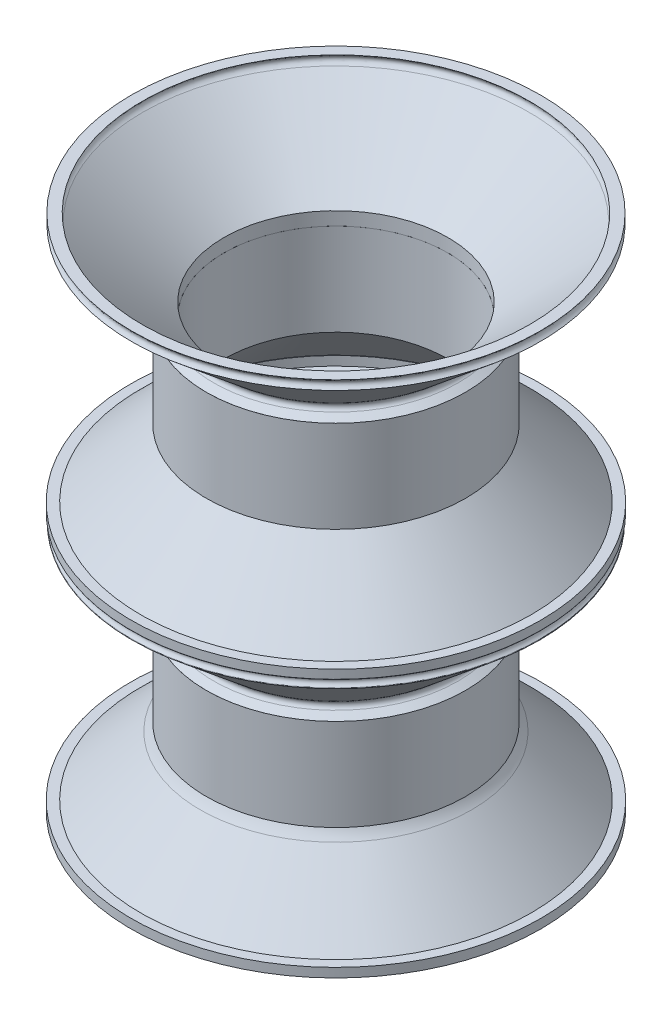
ISO-10303-21;
HEADER;
FILE_DESCRIPTION(('STEP AP214'),'2;1');
FILE_NAME('part.step','',(''),(''),'','','');
FILE_SCHEMA(('AUTOMOTIVE_DESIGN { 1 0 10303 214 1 1 1 1 }'));
ENDSEC;
DATA;
#1=APPLICATION_CONTEXT('core data for automotive mechanical design processes');
#2=APPLICATION_PROTOCOL_DEFINITION('international standard','automotive_design',2000,#1);
#3=PRODUCT_CONTEXT('',#1,'mechanical');
#4=PRODUCT('Part','Part','',(#3));
#5=PRODUCT_RELATED_PRODUCT_CATEGORY('part','',(#4));
#6=PRODUCT_DEFINITION_FORMATION('','',#4);
#7=PRODUCT_DEFINITION_CONTEXT('part definition',#1,'design');
#8=PRODUCT_DEFINITION('design','',#6,#7);
#9=PRODUCT_DEFINITION_SHAPE('','',#8);
#10=(LENGTH_UNIT() NAMED_UNIT(*) SI_UNIT(.MILLI.,.METRE.));
#11=(NAMED_UNIT(*) PLANE_ANGLE_UNIT() SI_UNIT($,.RADIAN.));
#12=(NAMED_UNIT(*) SI_UNIT($,.STERADIAN.) SOLID_ANGLE_UNIT());
#13=UNCERTAINTY_MEASURE_WITH_UNIT(LENGTH_MEASURE(1.E-05),#10,'distance_accuracy_value','');
#14=(GEOMETRIC_REPRESENTATION_CONTEXT(3) GLOBAL_UNCERTAINTY_ASSIGNED_CONTEXT((#13)) GLOBAL_UNIT_ASSIGNED_CONTEXT((#10,
#11,#12)) REPRESENTATION_CONTEXT('',''));
#15=CARTESIAN_POINT('',(0.,0.,0.));
#16=DIRECTION('',(0.,0.,1.));
#17=DIRECTION('',(1.,0.,0.));
#18=AXIS2_PLACEMENT_3D('',#15,#16,#17);
#19=CARTESIAN_POINT('',(12.266246150267,28.1,0.));
#20=DIRECTION('',(0.,-1.,0.));
#21=DIRECTION('',(1.,0.,0.));
#22=AXIS2_PLACEMENT_3D('',#19,#20,#21);
#23=CONICAL_SURFACE('',#22,12.7105503207346,1.02390555454664);
#24=CARTESIAN_POINT('',(12.266246150267,27.7377114557299,0.));
#25=DIRECTION('',(0.,-1.,0.));
#26=DIRECTION('',(1.,0.,0.));
#27=AXIS2_PLACEMENT_3D('',#24,#25,#26);
#28=CIRCLE('',#27,13.3056020683309);
#29=CARTESIAN_POINT('',(25.5718482185979,27.7377114557299,0.));
#30=VERTEX_POINT('',#29);
#31=EDGE_CURVE('E11',#30,#30,#28,.T.);
#32=ORIENTED_EDGE('',*,*,#31,.T.);
#33=EDGE_LOOP('',(#32));
#34=FACE_BOUND('',#33,.T.);
#35=CARTESIAN_POINT('',(12.266246150267,27.2518152658715,0.));
#36=DIRECTION('',(0.,1.,0.));
#37=DIRECTION('',(-1.,0.,0.));
#38=AXIS2_PLACEMENT_3D('',#35,#36,#37);
#39=CIRCLE('',#38,14.1036769219207);
#40=CARTESIAN_POINT('',(-1.83743077165368,27.2518152658715,0.));
#41=VERTEX_POINT('',#40);
#42=EDGE_CURVE('E75',#41,#41,#39,.T.);
#43=ORIENTED_EDGE('',*,*,#42,.T.);
#44=EDGE_LOOP('',(#43));
#45=FACE_BOUND('',#44,.T.);
#46=ADVANCED_FACE('F52',(#34,#45),#23,.T.);
#47=CARTESIAN_POINT('',(12.266246150267,36.1,0.));
#48=DIRECTION('',(0.,1.,0.));
#49=DIRECTION('',(-1.,0.,0.));
#50=AXIS2_PLACEMENT_3D('',#47,#48,#49);
#51=CONICAL_SURFACE('',#50,22.2445790614883,0.87266462599717);
#52=CARTESIAN_POINT('',(12.266246150267,28.5478064534284,0.));
#53=DIRECTION('',(0.,1.,0.));
#54=DIRECTION('',(-1.,0.,0.));
#55=AXIS2_PLACEMENT_3D('',#52,#53,#54);
#56=CIRCLE('',#55,13.2442252703947);
#57=CARTESIAN_POINT('',(-0.977979120127719,28.5478064534284,0.));
#58=VERTEX_POINT('',#57);
#59=EDGE_CURVE('E59',#58,#58,#56,.T.);
#60=ORIENTED_EDGE('',*,*,#59,.T.);
#61=EDGE_LOOP('',(#60));
#62=FACE_BOUND('',#61,.T.);
#63=CARTESIAN_POINT('',(12.266246150267,36.1,0.));
#64=DIRECTION('',(0.,1.,0.));
#65=DIRECTION('',(-1.,0.,0.));
#66=AXIS2_PLACEMENT_3D('',#63,#64,#65);
#67=CIRCLE('',#66,22.2445790614883);
#68=CARTESIAN_POINT('',(-9.97833291122136,36.1,0.));
#69=VERTEX_POINT('',#68);
#70=EDGE_CURVE('E63',#69,#69,#67,.T.);
#71=ORIENTED_EDGE('',*,*,#70,.F.);
#72=EDGE_LOOP('',(#71));
#73=FACE_BOUND('',#72,.T.);
#74=ADVANCED_FACE('F121',(#62,#73),#51,.T.);
#75=CARTESIAN_POINT('',(12.266246150267,28.6997502558786,0.));
#76=DIRECTION('',(0.,1.,0.));
#77=DIRECTION('',(-1.,0.,0.));
#78=AXIS2_PLACEMENT_3D('',#75,#76,#77);
#79=CONICAL_SURFACE('',#78,12.1807257813488,0.87266462599717);
#80=CARTESIAN_POINT('',(12.266246150267,36.1,0.));
#81=DIRECTION('',(0.,-1.,0.));
#82=DIRECTION('',(1.,0.,0.));
#83=AXIS2_PLACEMENT_3D('',#80,#81,#82);
#84=CIRCLE('',#83,21.);
#85=CARTESIAN_POINT('',(33.266246150267,36.1,0.));
#86=VERTEX_POINT('',#85);
#87=EDGE_CURVE('E84',#86,#86,#84,.T.);
#88=ORIENTED_EDGE('',*,*,#87,.F.);
#89=EDGE_LOOP('',(#88));
#90=FACE_BOUND('',#89,.T.);
#91=CARTESIAN_POINT('',(12.266246150267,28.6997502558786,0.));
#92=DIRECTION('',(0.,1.,0.));
#93=DIRECTION('',(-1.,0.,0.));
#94=AXIS2_PLACEMENT_3D('',#91,#92,#93);
#95=CIRCLE('',#94,12.1807257813488);
#96=CARTESIAN_POINT('',(0.0855203689181672,28.6997502558786,0.));
#97=VERTEX_POINT('',#96);
#98=EDGE_CURVE('E67',#97,#97,#95,.T.);
#99=ORIENTED_EDGE('',*,*,#98,.F.);
#100=EDGE_LOOP('',(#99));
#101=FACE_BOUND('',#100,.T.);
#102=ADVANCED_FACE('F117',(#90,#101),#79,.F.);
#103=CARTESIAN_POINT('',(12.266246150267,35.7090180328199,0.));
#104=DIRECTION('',(0.,1.,0.));
#105=DIRECTION('',(-1.,0.,0.));
#106=AXIS2_PLACEMENT_3D('',#103,#104,#105);
#107=CYLINDRICAL_SURFACE('',#106,12.1807257813488);
#108=ORIENTED_EDGE('',*,*,#98,.T.);
#109=EDGE_LOOP('',(#108));
#110=FACE_BOUND('',#109,.T.);
#111=CARTESIAN_POINT('',(12.266246150267,27.2518152658715,0.));
#112=DIRECTION('',(0.,1.,0.));
#113=DIRECTION('',(-1.,0.,0.));
#114=AXIS2_PLACEMENT_3D('',#111,#112,#113);
#115=CIRCLE('',#114,12.1807257813488);
#116=CARTESIAN_POINT('',(0.0855203689181672,27.2518152658715,0.));
#117=VERTEX_POINT('',#116);
#118=EDGE_CURVE('E72',#117,#117,#115,.T.);
#119=ORIENTED_EDGE('',*,*,#118,.F.);
#120=EDGE_LOOP('',(#119));
#121=FACE_BOUND('',#120,.T.);
#122=ADVANCED_FACE('F113',(#110,#121),#107,.F.);
#123=CARTESIAN_POINT('',(0.0855203689181681,27.2518152658715,0.));
#124=DIRECTION('',(0.,-1.,0.));
#125=DIRECTION('',(1.,0.,0.));
#126=AXIS2_PLACEMENT_3D('',#123,#124,#125);
#127=PLANE('',#126);
#128=ORIENTED_EDGE('',*,*,#118,.T.);
#129=EDGE_LOOP('',(#128));
#130=FACE_BOUND('',#129,.T.);
#131=ORIENTED_EDGE('',*,*,#42,.F.);
#132=EDGE_LOOP('',(#131));
#133=FACE_BOUND('',#132,.T.);
#134=ADVANCED_FACE('F110',(#130,#133),#127,.T.);
#135=CARTESIAN_POINT('',(12.266246150267,28.1647842318689,0.));
#136=DIRECTION('',(0.,1.,0.));
#137=DIRECTION('',(-1.,0.,0.));
#138=AXIS2_PLACEMENT_3D('',#135,#136,#137);
#139=TOROIDAL_SURFACE('',#138,13.565619075238,0.5);
#140=ORIENTED_EDGE('',*,*,#31,.F.);
#141=EDGE_LOOP('',(#140));
#142=FACE_BOUND('',#141,.T.);
#143=ORIENTED_EDGE('',*,*,#59,.F.);
#144=EDGE_LOOP('',(#143));
#145=FACE_BOUND('',#144,.T.);
#146=ADVANCED_FACE('F54',(#142,#145),#139,.F.);
#147=CARTESIAN_POINT('',(-8.73375384973302,36.1,0.));
#148=CARTESIAN_POINT('',(-9.41713424360817,36.5547580248928,0.));
#149=CARTESIAN_POINT('',(-8.79657882871846,37.1,0.));
#150=B_SPLINE_CURVE_WITH_KNOTS('',2,(#147,#148,#149),.UNSPECIFIED.,.F.,.F.,(3,3),(0.,1.),.UNSPECIFIED.);
#151=CARTESIAN_POINT('',(12.266246150267,8.13015566974782,0.));
#152=DIRECTION('',(0.,-1.,0.));
#153=AXIS1_PLACEMENT('',#151,#152);
#154=SURFACE_OF_REVOLUTION('',#150,#153);
#155=CARTESIAN_POINT('',(12.266246150267,37.1,0.));
#156=DIRECTION('',(0.,-1.,0.));
#157=DIRECTION('',(1.,0.,0.));
#158=AXIS2_PLACEMENT_3D('',#155,#156,#157);
#159=CIRCLE('',#158,21.0628249789854);
#160=CARTESIAN_POINT('',(33.3290711292524,37.1,0.));
#161=VERTEX_POINT('',#160);
#162=EDGE_CURVE('E78',#161,#161,#159,.T.);
#163=ORIENTED_EDGE('',*,*,#162,.F.);
#164=EDGE_LOOP('',(#163));
#165=FACE_BOUND('',#164,.T.);
#166=ORIENTED_EDGE('',*,*,#87,.T.);
#167=EDGE_LOOP('',(#166));
#168=FACE_BOUND('',#167,.T.);
#169=ADVANCED_FACE('F105',(#165,#168),#154,.T.);
#170=CARTESIAN_POINT('',(-8.79657882871846,37.1,0.));
#171=DIRECTION('',(0.,-1.,0.));
#172=DIRECTION('',(1.,0.,0.));
#173=AXIS2_PLACEMENT_3D('',#170,#171,#172);
#174=PLANE('',#173);
#175=CARTESIAN_POINT('',(12.266246150267,37.1,0.));
#176=DIRECTION('',(0.,-1.,0.));
#177=DIRECTION('',(1.,0.,0.));
#178=AXIS2_PLACEMENT_3D('',#175,#176,#177);
#179=CIRCLE('',#178,22.2445790614883);
#180=CARTESIAN_POINT('',(34.5108252117553,37.1,0.));
#181=VERTEX_POINT('',#180);
#182=EDGE_CURVE('E81',#181,#181,#179,.T.);
#183=ORIENTED_EDGE('',*,*,#182,.F.);
#184=EDGE_LOOP('',(#183));
#185=FACE_BOUND('',#184,.T.);
#186=ORIENTED_EDGE('',*,*,#162,.T.);
#187=EDGE_LOOP('',(#186));
#188=FACE_BOUND('',#187,.T.);
#189=ADVANCED_FACE('F101',(#185,#188),#174,.F.);
#190=CARTESIAN_POINT('',(-9.97833291122136,37.1,0.));
#191=CARTESIAN_POINT('',(-9.32229251414753,36.5833569168223,0.));
#192=CARTESIAN_POINT('',(-9.97833291122136,36.1,0.));
#193=B_SPLINE_CURVE_WITH_KNOTS('',2,(#190,#191,#192),.UNSPECIFIED.,.F.,.F.,(3,3),(0.,1.),.UNSPECIFIED.);
#194=CARTESIAN_POINT('',(12.266246150267,8.13015566974782,0.));
#195=DIRECTION('',(0.,-1.,0.));
#196=AXIS1_PLACEMENT('',#194,#195);
#197=SURFACE_OF_REVOLUTION('',#193,#196);
#198=ORIENTED_EDGE('',*,*,#70,.T.);
#199=EDGE_LOOP('',(#198));
#200=FACE_BOUND('',#199,.T.);
#201=ORIENTED_EDGE('',*,*,#182,.T.);
#202=EDGE_LOOP('',(#201));
#203=FACE_BOUND('',#202,.T.);
#204=ADVANCED_FACE('F98',(#200,#203),#197,.T.);
#205=CLOSED_SHELL('',(#46,#74,#102,#122,#134,#146,#169,#189,#204));
#206=MANIFOLD_SOLID_BREP('B2',#205);
#207=CARTESIAN_POINT('',(12.266246150267,17.2518152658715,0.));
#208=DIRECTION('',(0.,-1.,0.));
#209=DIRECTION('',(1.,0.,0.));
#210=AXIS2_PLACEMENT_3D('',#207,#208,#209);
#211=PLANE('',#210);
#212=CARTESIAN_POINT('',(12.266246150267,17.2518152658715,0.));
#213=DIRECTION('',(0.,-1.,0.));
#214=DIRECTION('',(1.,0.,0.));
#215=AXIS2_PLACEMENT_3D('',#212,#213,#214);
#216=CIRCLE('',#215,13.8777820561965);
#217=CARTESIAN_POINT('',(26.1440282064635,17.2518152658715,0.));
#218=VERTEX_POINT('',#217);
#219=EDGE_CURVE('E222',#218,#218,#216,.T.);
#220=ORIENTED_EDGE('',*,*,#219,.F.);
#221=EDGE_LOOP('',(#220));
#222=FACE_BOUND('',#221,.T.);
#223=CARTESIAN_POINT('',(12.266246150267,17.2518152658715,0.));
#224=DIRECTION('',(0.,-1.,0.));
#225=DIRECTION('',(1.,0.,0.));
#226=AXIS2_PLACEMENT_3D('',#223,#224,#225);
#227=CIRCLE('',#226,14.1036769219207);
#228=CARTESIAN_POINT('',(26.3699230721876,17.2518152658715,0.));
#229=VERTEX_POINT('',#228);
#230=EDGE_CURVE('E226',#229,#229,#227,.T.);
#231=ORIENTED_EDGE('',*,*,#230,.T.);
#232=EDGE_LOOP('',(#231));
#233=FACE_BOUND('',#232,.T.);
#234=ADVANCED_FACE('F211',(#222,#233),#211,.T.);
#235=CARTESIAN_POINT('',(12.266246150267,27.2518152658715,0.));
#236=DIRECTION('',(0.,-1.,0.));
#237=DIRECTION('',(1.,0.,0.));
#238=AXIS2_PLACEMENT_3D('',#235,#236,#237);
#239=PLANE('',#238);
#240=CARTESIAN_POINT('',(12.266246150267,27.2518152658715,0.));
#241=DIRECTION('',(0.,-1.,0.));
#242=DIRECTION('',(1.,0.,0.));
#243=AXIS2_PLACEMENT_3D('',#240,#241,#242);
#244=CIRCLE('',#243,14.1036769219207);
#245=CARTESIAN_POINT('',(26.3699230721876,27.2518152658715,0.));
#246=VERTEX_POINT('',#245);
#247=EDGE_CURVE('E229',#246,#246,#244,.T.);
#248=ORIENTED_EDGE('',*,*,#247,.F.);
#249=EDGE_LOOP('',(#248));
#250=FACE_BOUND('',#249,.T.);
#251=CARTESIAN_POINT('',(12.266246150267,27.2518152658715,0.));
#252=DIRECTION('',(0.,-1.,0.));
#253=DIRECTION('',(1.,0.,0.));
#254=AXIS2_PLACEMENT_3D('',#251,#252,#253);
#255=CIRCLE('',#254,12.1807257813488);
#256=CARTESIAN_POINT('',(24.4469719316158,27.2518152658715,0.));
#257=VERTEX_POINT('',#256);
#258=EDGE_CURVE('E232',#257,#257,#255,.T.);
#259=ORIENTED_EDGE('',*,*,#258,.T.);
#260=EDGE_LOOP('',(#259));
#261=FACE_BOUND('',#260,.T.);
#262=ADVANCED_FACE('F277',(#250,#261),#239,.F.);
#263=CARTESIAN_POINT('',(12.266246150267,17.2518152658715,0.));
#264=DIRECTION('',(0.,1.,0.));
#265=DIRECTION('',(-1.,0.,0.));
#266=AXIS2_PLACEMENT_3D('',#263,#264,#265);
#267=CYLINDRICAL_SURFACE('',#266,14.1036769219207);
#268=ORIENTED_EDGE('',*,*,#230,.F.);
#269=EDGE_LOOP('',(#268));
#270=FACE_BOUND('',#269,.T.);
#271=ORIENTED_EDGE('',*,*,#247,.T.);
#272=EDGE_LOOP('',(#271));
#273=FACE_BOUND('',#272,.T.);
#274=ADVANCED_FACE('F283',(#270,#273),#267,.T.);
#275=CARTESIAN_POINT('',(12.266246150267,17.2518152658715,0.));
#276=DIRECTION('',(0.,1.,0.));
#277=DIRECTION('',(-1.,0.,0.));
#278=AXIS2_PLACEMENT_3D('',#275,#276,#277);
#279=CYLINDRICAL_SURFACE('',#278,12.1807257813488);
#280=CARTESIAN_POINT('',(12.266246150267,17.2518152658715,0.));
#281=DIRECTION('',(0.,-1.,0.));
#282=DIRECTION('',(1.,0.,0.));
#283=AXIS2_PLACEMENT_3D('',#280,#281,#282);
#284=CIRCLE('',#283,12.1807257813488);
#285=CARTESIAN_POINT('',(24.4469719316158,17.2518152658715,0.));
#286=VERTEX_POINT('',#285);
#287=EDGE_CURVE('E240',#286,#286,#284,.T.);
#288=ORIENTED_EDGE('',*,*,#287,.T.);
#289=EDGE_LOOP('',(#288));
#290=FACE_BOUND('',#289,.T.);
#291=ORIENTED_EDGE('',*,*,#258,.F.);
#292=EDGE_LOOP('',(#291));
#293=FACE_BOUND('',#292,.T.);
#294=ADVANCED_FACE('F289',(#290,#293),#279,.F.);
#295=CARTESIAN_POINT('',(12.266246150267,17.2518152658715,0.));
#296=DIRECTION('',(0.,-1.,0.));
#297=DIRECTION('',(1.,0.,0.));
#298=AXIS2_PLACEMENT_3D('',#295,#296,#297);
#299=CONICAL_SURFACE('',#298,13.8777820561965,0.785398163397446);
#300=CARTESIAN_POINT('',(12.266246150267,9.87071250528384,0.));
#301=DIRECTION('',(0.,-1.,0.));
#302=DIRECTION('',(1.,0.,0.));
#303=AXIS2_PLACEMENT_3D('',#300,#301,#302);
#304=CIRCLE('',#303,21.2588848167841);
#305=CARTESIAN_POINT('',(33.5251309670511,9.87071250528385,0.));
#306=VERTEX_POINT('',#305);
#307=EDGE_CURVE('E236',#306,#306,#304,.T.);
#308=ORIENTED_EDGE('',*,*,#307,.F.);
#309=EDGE_LOOP('',(#308));
#310=FACE_BOUND('',#309,.T.);
#311=ORIENTED_EDGE('',*,*,#219,.T.);
#312=EDGE_LOOP('',(#311));
#313=FACE_BOUND('',#312,.T.);
#314=ADVANCED_FACE('F296',(#310,#313),#299,.T.);
#315=CARTESIAN_POINT('',(12.266246150267,9.87071250528384,0.));
#316=DIRECTION('',(0.,-1.,0.));
#317=DIRECTION('',(1.,0.,0.));
#318=AXIS2_PLACEMENT_3D('',#315,#316,#317);
#319=CONICAL_SURFACE('',#318,19.5618285419364,0.785398163397446);
#320=ORIENTED_EDGE('',*,*,#287,.F.);
#321=EDGE_LOOP('',(#320));
#322=FACE_BOUND('',#321,.T.);
#323=CARTESIAN_POINT('',(12.266246150267,9.87071250528384,0.));
#324=DIRECTION('',(0.,-1.,0.));
#325=DIRECTION('',(1.,0.,0.));
#326=AXIS2_PLACEMENT_3D('',#323,#324,#325);
#327=CIRCLE('',#326,19.5618285419364);
#328=CARTESIAN_POINT('',(31.8280746922034,9.87071250528384,0.));
#329=VERTEX_POINT('',#328);
#330=EDGE_CURVE('E241',#329,#329,#327,.T.);
#331=ORIENTED_EDGE('',*,*,#330,.T.);
#332=EDGE_LOOP('',(#331));
#333=FACE_BOUND('',#332,.T.);
#334=ADVANCED_FACE('F273',(#322,#333),#319,.F.);
#335=CARTESIAN_POINT('',(12.266246150267,9.87071250528384,0.));
#336=DIRECTION('',(0.,-1.,0.));
#337=DIRECTION('',(1.,0.,0.));
#338=AXIS2_PLACEMENT_3D('',#335,#336,#337);
#339=PLANE('',#338);
#340=CARTESIAN_POINT('',(12.266246150267,9.87071250528384,0.));
#341=DIRECTION('',(0.,-1.,0.));
#342=DIRECTION('',(1.,0.,0.));
#343=AXIS2_PLACEMENT_3D('',#340,#341,#342);
#344=CIRCLE('',#343,19.5118285419364);
#345=CARTESIAN_POINT('',(31.7780746922034,9.87071250528384,0.));
#346=VERTEX_POINT('',#345);
#347=EDGE_CURVE('E250',#346,#346,#344,.T.);
#348=ORIENTED_EDGE('',*,*,#347,.T.);
#349=EDGE_LOOP('',(#348));
#350=FACE_BOUND('',#349,.T.);
#351=ORIENTED_EDGE('',*,*,#330,.F.);
#352=EDGE_LOOP('',(#351));
#353=FACE_BOUND('',#352,.T.);
#354=ADVANCED_FACE('F262',(#350,#353),#339,.F.);
#355=CARTESIAN_POINT('',(12.266246150267,8.87071250528384,0.));
#356=DIRECTION('',(0.,-1.,0.));
#357=DIRECTION('',(1.,0.,0.));
#358=AXIS2_PLACEMENT_3D('',#355,#356,#357);
#359=PLANE('',#358);
#360=CARTESIAN_POINT('',(12.266246150267,8.87071250528384,0.));
#361=DIRECTION('',(0.,-1.,0.));
#362=DIRECTION('',(1.,0.,0.));
#363=AXIS2_PLACEMENT_3D('',#360,#361,#362);
#364=CIRCLE('',#363,22.2445790614883);
#365=CARTESIAN_POINT('',(34.5108252117553,8.87071250528384,0.));
#366=VERTEX_POINT('',#365);
#367=EDGE_CURVE('E218',#366,#366,#364,.T.);
#368=ORIENTED_EDGE('',*,*,#367,.T.);
#369=EDGE_LOOP('',(#368));
#370=FACE_BOUND('',#369,.T.);
#371=CARTESIAN_POINT('',(12.266246150267,8.87071250528384,0.));
#372=DIRECTION('',(0.,-1.,0.));
#373=DIRECTION('',(1.,0.,0.));
#374=AXIS2_PLACEMENT_3D('',#371,#372,#373);
#375=CIRCLE('',#374,19.5118285419364);
#376=CARTESIAN_POINT('',(31.7780746922034,8.87071250528384,0.));
#377=VERTEX_POINT('',#376);
#378=EDGE_CURVE('E249',#377,#377,#375,.T.);
#379=ORIENTED_EDGE('',*,*,#378,.F.);
#380=EDGE_LOOP('',(#379));
#381=FACE_BOUND('',#380,.T.);
#382=ADVANCED_FACE('F259',(#370,#381),#359,.T.);
#383=ORIENTED_EDGE('',*,*,#307,.T.);
#384=EDGE_LOOP('',(#383));
#385=FACE_BOUND('',#384,.T.);
#386=CARTESIAN_POINT('',(12.266246150267,9.87071250528384,0.));
#387=DIRECTION('',(0.,-1.,0.));
#388=DIRECTION('',(1.,0.,0.));
#389=AXIS2_PLACEMENT_3D('',#386,#387,#388);
#390=CIRCLE('',#389,22.2945790614883);
#391=CARTESIAN_POINT('',(34.5608252117553,9.87071250528384,0.));
#392=VERTEX_POINT('',#391);
#393=EDGE_CURVE('E244',#392,#392,#390,.T.);
#394=ORIENTED_EDGE('',*,*,#393,.F.);
#395=EDGE_LOOP('',(#394));
#396=FACE_BOUND('',#395,.T.);
#397=ADVANCED_FACE('F261',(#385,#396),#339,.F.);
#398=CARTESIAN_POINT('',(12.266246150267,8.87071250528384,0.));
#399=DIRECTION('',(0.,1.,0.));
#400=DIRECTION('',(-1.,0.,0.));
#401=AXIS2_PLACEMENT_3D('',#398,#399,#400);
#402=CYLINDRICAL_SURFACE('',#401,22.2945790614883);
#403=CARTESIAN_POINT('',(12.266246150267,8.92071250528384,0.));
#404=DIRECTION('',(0.,-1.,0.));
#405=DIRECTION('',(1.,0.,0.));
#406=AXIS2_PLACEMENT_3D('',#403,#404,#405);
#407=CIRCLE('',#406,22.2945790614883);
#408=CARTESIAN_POINT('',(34.5608252117553,8.92071250528384,0.));
#409=VERTEX_POINT('',#408);
#410=EDGE_CURVE('E51',#409,#409,#407,.F.);
#411=ORIENTED_EDGE('',*,*,#410,.T.);
#412=EDGE_LOOP('',(#411));
#413=FACE_BOUND('',#412,.T.);
#414=ORIENTED_EDGE('',*,*,#393,.T.);
#415=EDGE_LOOP('',(#414));
#416=FACE_BOUND('',#415,.T.);
#417=ADVANCED_FACE('F269',(#413,#416),#402,.T.);
#418=CARTESIAN_POINT('',(12.266246150267,8.87071250528384,0.));
#419=DIRECTION('',(0.,1.,0.));
#420=DIRECTION('',(-1.,0.,0.));
#421=AXIS2_PLACEMENT_3D('',#418,#419,#420);
#422=CYLINDRICAL_SURFACE('',#421,19.5118285419364);
#423=ORIENTED_EDGE('',*,*,#378,.T.);
#424=EDGE_LOOP('',(#423));
#425=FACE_BOUND('',#424,.T.);
#426=ORIENTED_EDGE('',*,*,#347,.F.);
#427=EDGE_LOOP('',(#426));
#428=FACE_BOUND('',#427,.T.);
#429=ADVANCED_FACE('F256',(#425,#428),#422,.F.);
#430=CARTESIAN_POINT('',(12.266246150267,8.92071250528384,0.));
#431=DIRECTION('',(0.,-1.,0.));
#432=DIRECTION('',(1.,0.,0.));
#433=AXIS2_PLACEMENT_3D('',#430,#431,#432);
#434=TOROIDAL_SURFACE('',#433,22.2445790614883,0.05);
#435=ORIENTED_EDGE('',*,*,#410,.F.);
#436=EDGE_LOOP('',(#435));
#437=FACE_BOUND('',#436,.T.);
#438=ORIENTED_EDGE('',*,*,#367,.F.);
#439=EDGE_LOOP('',(#438));
#440=FACE_BOUND('',#439,.T.);
#441=ADVANCED_FACE('F213',(#437,#440),#434,.T.);
#442=CLOSED_SHELL('',(#234,#262,#274,#294,#314,#334,#354,#382,#397,#417,#429,#441));
#443=MANIFOLD_SOLID_BREP('B6',#442);
#444=CARTESIAN_POINT('',(12.266246150267,-0.84818473412852,0.));
#445=DIRECTION('',(0.,-1.,0.));
#446=DIRECTION('',(1.,0.,0.));
#447=AXIS2_PLACEMENT_3D('',#444,#445,#446);
#448=PLANE('',#447);
#449=CARTESIAN_POINT('',(12.266246150267,-0.84818473412852,0.));
#450=DIRECTION('',(0.,-1.,0.));
#451=DIRECTION('',(1.,0.,0.));
#452=AXIS2_PLACEMENT_3D('',#449,#450,#451);
#453=CIRCLE('',#452,14.1036769219207);
#454=CARTESIAN_POINT('',(26.3699230721876,-0.848184734128518,0.));
#455=VERTEX_POINT('',#454);
#456=EDGE_CURVE('E412',#455,#455,#453,.T.);
#457=ORIENTED_EDGE('',*,*,#456,.F.);
#458=EDGE_LOOP('',(#457));
#459=FACE_BOUND('',#458,.T.);
#460=CARTESIAN_POINT('',(12.266246150267,-0.84818473412852,0.));
#461=DIRECTION('',(0.,-1.,0.));
#462=DIRECTION('',(1.,0.,0.));
#463=AXIS2_PLACEMENT_3D('',#460,#461,#462);
#464=CIRCLE('',#463,12.1807257813488);
#465=CARTESIAN_POINT('',(24.4469719316158,-0.848184734128518,0.));
#466=VERTEX_POINT('',#465);
#467=EDGE_CURVE('E418',#466,#466,#464,.T.);
#468=ORIENTED_EDGE('',*,*,#467,.T.);
#469=EDGE_LOOP('',(#468));
#470=FACE_BOUND('',#469,.T.);
#471=ADVANCED_FACE('F399',(#459,#470),#448,.F.);
#472=CARTESIAN_POINT('',(12.266246150267,-10.8481847341285,0.));
#473=DIRECTION('',(0.,1.,0.));
#474=DIRECTION('',(-1.,0.,0.));
#475=AXIS2_PLACEMENT_3D('',#472,#473,#474);
#476=CYLINDRICAL_SURFACE('',#475,14.1036769219207);
#477=CARTESIAN_POINT('',(12.266246150267,-10.8481847341285,0.));
#478=DIRECTION('',(0.,-1.,0.));
#479=DIRECTION('',(1.,0.,0.));
#480=AXIS2_PLACEMENT_3D('',#477,#478,#479);
#481=CIRCLE('',#480,14.1036769219207);
#482=CARTESIAN_POINT('',(26.3699230721876,-10.8481847341285,0.));
#483=VERTEX_POINT('',#482);
#484=EDGE_CURVE('E407',#483,#483,#481,.T.);
#485=ORIENTED_EDGE('',*,*,#484,.F.);
#486=EDGE_LOOP('',(#485));
#487=FACE_BOUND('',#486,.T.);
#488=ORIENTED_EDGE('',*,*,#456,.T.);
#489=EDGE_LOOP('',(#488));
#490=FACE_BOUND('',#489,.T.);
#491=ADVANCED_FACE('F472',(#487,#490),#476,.T.);
#492=CARTESIAN_POINT('',(12.266246150267,-10.8481847341285,0.));
#493=DIRECTION('',(0.,1.,0.));
#494=DIRECTION('',(-1.,0.,0.));
#495=AXIS2_PLACEMENT_3D('',#492,#493,#494);
#496=CYLINDRICAL_SURFACE('',#495,12.1807257813488);
#497=CARTESIAN_POINT('',(12.266246150267,-10.8481847341285,0.));
#498=DIRECTION('',(0.,-1.,0.));
#499=DIRECTION('',(1.,0.,0.));
#500=AXIS2_PLACEMENT_3D('',#497,#498,#499);
#501=CIRCLE('',#500,12.1807257813488);
#502=CARTESIAN_POINT('',(24.4469719316158,-10.8481847341285,0.));
#503=VERTEX_POINT('',#502);
#504=EDGE_CURVE('E427',#503,#503,#501,.T.);
#505=ORIENTED_EDGE('',*,*,#504,.T.);
#506=EDGE_LOOP('',(#505));
#507=FACE_BOUND('',#506,.T.);
#508=ORIENTED_EDGE('',*,*,#467,.F.);
#509=EDGE_LOOP('',(#508));
#510=FACE_BOUND('',#509,.T.);
#511=ADVANCED_FACE('F478',(#507,#510),#496,.F.);
#512=CARTESIAN_POINT('',(12.266246150267,-10.8481847341285,0.));
#513=DIRECTION('',(0.,-1.,0.));
#514=DIRECTION('',(1.,0.,0.));
#515=AXIS2_PLACEMENT_3D('',#512,#513,#514);
#516=CONICAL_SURFACE('',#515,13.8777820561965,0.785398163397446);
#517=CARTESIAN_POINT('',(12.266246150267,-11.7524412361696,0.));
#518=DIRECTION('',(0.,1.,0.));
#519=DIRECTION('',(-1.,0.,0.));
#520=AXIS2_PLACEMENT_3D('',#517,#518,#519);
#521=CIRCLE('',#520,14.7820385582376);
#522=CARTESIAN_POINT('',(-2.51579240797061,-11.7524412361696,0.));
#523=VERTEX_POINT('',#522);
#524=EDGE_CURVE('E210',#523,#523,#521,.F.);
#525=ORIENTED_EDGE('',*,*,#524,.T.);
#526=EDGE_LOOP('',(#525));
#527=FACE_BOUND('',#526,.T.);
#528=CARTESIAN_POINT('',(12.266246150267,-18.2292874947162,0.));
#529=DIRECTION('',(0.,-1.,0.));
#530=DIRECTION('',(1.,0.,0.));
#531=AXIS2_PLACEMENT_3D('',#528,#529,#530);
#532=CIRCLE('',#531,21.2588848167841);
#533=CARTESIAN_POINT('',(33.5251309670511,-18.2292874947162,0.));
#534=VERTEX_POINT('',#533);
#535=EDGE_CURVE('E423',#534,#534,#532,.T.);
#536=ORIENTED_EDGE('',*,*,#535,.F.);
#537=EDGE_LOOP('',(#536));
#538=FACE_BOUND('',#537,.T.);
#539=ADVANCED_FACE('F485',(#527,#538),#516,.T.);
#540=CARTESIAN_POINT('',(12.266246150267,-18.2292874947162,0.));
#541=DIRECTION('',(0.,-1.,0.));
#542=DIRECTION('',(1.,0.,0.));
#543=AXIS2_PLACEMENT_3D('',#540,#541,#542);
#544=CONICAL_SURFACE('',#543,19.5618285419364,0.785398163397446);
#545=ORIENTED_EDGE('',*,*,#504,.F.);
#546=EDGE_LOOP('',(#545));
#547=FACE_BOUND('',#546,.T.);
#548=CARTESIAN_POINT('',(12.266246150267,-18.2292874947162,0.));
#549=DIRECTION('',(0.,-1.,0.));
#550=DIRECTION('',(1.,0.,0.));
#551=AXIS2_PLACEMENT_3D('',#548,#549,#550);
#552=CIRCLE('',#551,19.5618285419364);
#553=CARTESIAN_POINT('',(31.8280746922034,-18.2292874947162,0.));
#554=VERTEX_POINT('',#553);
#555=EDGE_CURVE('E428',#554,#554,#552,.T.);
#556=ORIENTED_EDGE('',*,*,#555,.T.);
#557=EDGE_LOOP('',(#556));
#558=FACE_BOUND('',#557,.T.);
#559=ADVANCED_FACE('F468',(#547,#558),#544,.F.);
#560=CARTESIAN_POINT('',(12.266246150267,-18.2292874947162,0.));
#561=DIRECTION('',(0.,-1.,0.));
#562=DIRECTION('',(1.,0.,0.));
#563=AXIS2_PLACEMENT_3D('',#560,#561,#562);
#564=PLANE('',#563);
#565=CARTESIAN_POINT('',(12.266246150267,-18.2292874947162,0.));
#566=DIRECTION('',(0.,-1.,0.));
#567=DIRECTION('',(1.,0.,0.));
#568=AXIS2_PLACEMENT_3D('',#565,#566,#567);
#569=CIRCLE('',#568,19.5118285419364);
#570=CARTESIAN_POINT('',(31.7780746922034,-18.2292874947162,0.));
#571=VERTEX_POINT('',#570);
#572=EDGE_CURVE('E444',#571,#571,#569,.T.);
#573=ORIENTED_EDGE('',*,*,#572,.T.);
#574=EDGE_LOOP('',(#573));
#575=FACE_BOUND('',#574,.T.);
#576=ORIENTED_EDGE('',*,*,#555,.F.);
#577=EDGE_LOOP('',(#576));
#578=FACE_BOUND('',#577,.T.);
#579=ADVANCED_FACE('F458',(#575,#578),#564,.F.);
#580=CARTESIAN_POINT('',(12.266246150267,-19.2292874947162,0.));
#581=DIRECTION('',(0.,-1.,0.));
#582=DIRECTION('',(1.,0.,0.));
#583=AXIS2_PLACEMENT_3D('',#580,#581,#582);
#584=PLANE('',#583);
#585=CARTESIAN_POINT('',(12.266246150267,-19.2292874947162,0.));
#586=DIRECTION('',(0.,-1.,0.));
#587=DIRECTION('',(1.,0.,0.));
#588=AXIS2_PLACEMENT_3D('',#585,#586,#587);
#589=CIRCLE('',#588,22.2945790614883);
#590=CARTESIAN_POINT('',(34.5608252117553,-19.2292874947162,0.));
#591=VERTEX_POINT('',#590);
#592=EDGE_CURVE('E432',#591,#591,#589,.T.);
#593=ORIENTED_EDGE('',*,*,#592,.T.);
#594=EDGE_LOOP('',(#593));
#595=FACE_BOUND('',#594,.T.);
#596=CARTESIAN_POINT('',(12.266246150267,-19.2292874947162,0.));
#597=DIRECTION('',(0.,-1.,0.));
#598=DIRECTION('',(1.,0.,0.));
#599=AXIS2_PLACEMENT_3D('',#596,#597,#598);
#600=CIRCLE('',#599,19.5118285419364);
#601=CARTESIAN_POINT('',(31.7780746922034,-19.2292874947162,0.));
#602=VERTEX_POINT('',#601);
#603=EDGE_CURVE('E440',#602,#602,#600,.T.);
#604=ORIENTED_EDGE('',*,*,#603,.F.);
#605=EDGE_LOOP('',(#604));
#606=FACE_BOUND('',#605,.T.);
#607=ADVANCED_FACE('F455',(#595,#606),#584,.T.);
#608=ORIENTED_EDGE('',*,*,#535,.T.);
#609=EDGE_LOOP('',(#608));
#610=FACE_BOUND('',#609,.T.);
#611=CARTESIAN_POINT('',(12.266246150267,-18.2292874947162,0.));
#612=DIRECTION('',(0.,-1.,0.));
#613=DIRECTION('',(1.,0.,0.));
#614=AXIS2_PLACEMENT_3D('',#611,#612,#613);
#615=CIRCLE('',#614,22.2945790614883);
#616=CARTESIAN_POINT('',(34.5608252117553,-18.2292874947162,0.));
#617=VERTEX_POINT('',#616);
#618=EDGE_CURVE('E436',#617,#617,#615,.T.);
#619=ORIENTED_EDGE('',*,*,#618,.F.);
#620=EDGE_LOOP('',(#619));
#621=FACE_BOUND('',#620,.T.);
#622=ADVANCED_FACE('F457',(#610,#621),#564,.F.);
#623=CARTESIAN_POINT('',(12.266246150267,-19.2292874947162,0.));
#624=DIRECTION('',(0.,1.,0.));
#625=DIRECTION('',(-1.,0.,0.));
#626=AXIS2_PLACEMENT_3D('',#623,#624,#625);
#627=CYLINDRICAL_SURFACE('',#626,22.2945790614883);
#628=ORIENTED_EDGE('',*,*,#592,.F.);
#629=EDGE_LOOP('',(#628));
#630=FACE_BOUND('',#629,.T.);
#631=ORIENTED_EDGE('',*,*,#618,.T.);
#632=EDGE_LOOP('',(#631));
#633=FACE_BOUND('',#632,.T.);
#634=ADVANCED_FACE('F465',(#630,#633),#627,.T.);
#635=CARTESIAN_POINT('',(12.266246150267,-19.2292874947162,0.));
#636=DIRECTION('',(0.,1.,0.));
#637=DIRECTION('',(-1.,0.,0.));
#638=AXIS2_PLACEMENT_3D('',#635,#636,#637);
#639=CYLINDRICAL_SURFACE('',#638,19.5118285419364);
#640=ORIENTED_EDGE('',*,*,#603,.T.);
#641=EDGE_LOOP('',(#640));
#642=FACE_BOUND('',#641,.T.);
#643=ORIENTED_EDGE('',*,*,#572,.F.);
#644=EDGE_LOOP('',(#643));
#645=FACE_BOUND('',#644,.T.);
#646=ADVANCED_FACE('F452',(#642,#645),#639,.F.);
#647=CARTESIAN_POINT('',(12.266246150267,-8.92401411142341,0.));
#648=DIRECTION('',(0.,1.,0.));
#649=DIRECTION('',(-1.,0.,0.));
#650=AXIS2_PLACEMENT_3D('',#647,#648,#649);
#651=TOROIDAL_SURFACE('',#650,17.6104656829838,4.);
#652=ORIENTED_EDGE('',*,*,#484,.T.);
#653=EDGE_LOOP('',(#652));
#654=FACE_BOUND('',#653,.T.);
#655=ORIENTED_EDGE('',*,*,#524,.F.);
#656=EDGE_LOOP('',(#655));
#657=FACE_BOUND('',#656,.T.);
#658=ADVANCED_FACE('F401',(#654,#657),#651,.F.);
#659=CLOSED_SHELL('',(#471,#491,#511,#539,#559,#579,#607,#622,#634,#646,#658));
#660=MANIFOLD_SOLID_BREP('B46',#659);
#661=CARTESIAN_POINT('',(12.266246150267,0.,0.));
#662=DIRECTION('',(0.,-1.,0.));
#663=DIRECTION('',(1.,0.,0.));
#664=AXIS2_PLACEMENT_3D('',#661,#662,#663);
#665=CONICAL_SURFACE('',#664,12.7105503207346,1.02390555454664);
#666=CARTESIAN_POINT('',(12.266246150267,-0.362288544270145,0.));
#667=DIRECTION('',(0.,-1.,0.));
#668=DIRECTION('',(1.,0.,0.));
#669=AXIS2_PLACEMENT_3D('',#666,#667,#668);
#670=CIRCLE('',#669,13.3056020683309);
#671=CARTESIAN_POINT('',(25.5718482185979,-0.362288544270144,0.));
#672=VERTEX_POINT('',#671);
#673=EDGE_CURVE('E587',#672,#672,#670,.T.);
#674=ORIENTED_EDGE('',*,*,#673,.T.);
#675=EDGE_LOOP('',(#674));
#676=FACE_BOUND('',#675,.T.);
#677=CARTESIAN_POINT('',(12.266246150267,-0.848184734128519,0.));
#678=DIRECTION('',(0.,1.,0.));
#679=DIRECTION('',(-1.,0.,0.));
#680=AXIS2_PLACEMENT_3D('',#677,#678,#679);
#681=CIRCLE('',#680,14.1036769219207);
#682=CARTESIAN_POINT('',(-1.83743077165368,-0.848184734128521,0.));
#683=VERTEX_POINT('',#682);
#684=EDGE_CURVE('E602',#683,#683,#681,.T.);
#685=ORIENTED_EDGE('',*,*,#684,.T.);
#686=EDGE_LOOP('',(#685));
#687=FACE_BOUND('',#686,.T.);
#688=ADVANCED_FACE('F576',(#676,#687),#665,.T.);
#689=CARTESIAN_POINT('',(12.266246150267,8.,0.));
#690=DIRECTION('',(0.,1.,0.));
#691=DIRECTION('',(-1.,0.,0.));
#692=AXIS2_PLACEMENT_3D('',#689,#690,#691);
#693=CONICAL_SURFACE('',#692,22.2445790614883,0.87266462599717);
#694=CARTESIAN_POINT('',(12.266246150267,7.95996199984405,0.));
#695=DIRECTION('',(0.,1.,0.));
#696=DIRECTION('',(-1.,0.,0.));
#697=AXIS2_PLACEMENT_3D('',#694,#695,#696);
#698=CIRCLE('',#697,22.1968636309622);
#699=CARTESIAN_POINT('',(-9.93061748069522,7.95996199984405,0.));
#700=VERTEX_POINT('',#699);
#701=EDGE_CURVE('E398',#700,#700,#698,.F.);
#702=ORIENTED_EDGE('',*,*,#701,.T.);
#703=EDGE_LOOP('',(#702));
#704=FACE_BOUND('',#703,.T.);
#705=CARTESIAN_POINT('',(12.266246150267,0.44780645342838,0.));
#706=DIRECTION('',(0.,1.,0.));
#707=DIRECTION('',(-1.,0.,0.));
#708=AXIS2_PLACEMENT_3D('',#705,#706,#707);
#709=CIRCLE('',#708,13.2442252703947);
#710=CARTESIAN_POINT('',(-0.977979120127719,0.447806453428379,0.));
#711=VERTEX_POINT('',#710);
#712=EDGE_CURVE('E591',#711,#711,#709,.T.);
#713=ORIENTED_EDGE('',*,*,#712,.T.);
#714=EDGE_LOOP('',(#713));
#715=FACE_BOUND('',#714,.T.);
#716=ADVANCED_FACE('F648',(#704,#715),#693,.T.);
#717=CARTESIAN_POINT('',(12.266246150267,0.599750255878579,0.));
#718=DIRECTION('',(0.,1.,0.));
#719=DIRECTION('',(-1.,0.,0.));
#720=AXIS2_PLACEMENT_3D('',#717,#718,#719);
#721=CONICAL_SURFACE('',#720,12.1807257813488,0.87266462599717);
#722=CARTESIAN_POINT('',(12.266246150267,8.,0.));
#723=DIRECTION('',(0.,-1.,0.));
#724=DIRECTION('',(1.,0.,0.));
#725=AXIS2_PLACEMENT_3D('',#722,#723,#724);
#726=CIRCLE('',#725,21.);
#727=CARTESIAN_POINT('',(33.266246150267,8.00000000000001,0.));
#728=VERTEX_POINT('',#727);
#729=EDGE_CURVE('E611',#728,#728,#726,.T.);
#730=ORIENTED_EDGE('',*,*,#729,.F.);
#731=EDGE_LOOP('',(#730));
#732=FACE_BOUND('',#731,.T.);
#733=CARTESIAN_POINT('',(12.266246150267,0.599750255878579,0.));
#734=DIRECTION('',(0.,1.,0.));
#735=DIRECTION('',(-1.,0.,0.));
#736=AXIS2_PLACEMENT_3D('',#733,#734,#735);
#737=CIRCLE('',#736,12.1807257813488);
#738=CARTESIAN_POINT('',(0.0855203689181672,0.599750255878578,0.));
#739=VERTEX_POINT('',#738);
#740=EDGE_CURVE('E596',#739,#739,#737,.T.);
#741=ORIENTED_EDGE('',*,*,#740,.F.);
#742=EDGE_LOOP('',(#741));
#743=FACE_BOUND('',#742,.T.);
#744=ADVANCED_FACE('F644',(#732,#743),#721,.F.);
#745=CARTESIAN_POINT('',(12.266246150267,7.60901803281994,0.));
#746=DIRECTION('',(0.,1.,0.));
#747=DIRECTION('',(-1.,0.,0.));
#748=AXIS2_PLACEMENT_3D('',#745,#746,#747);
#749=CYLINDRICAL_SURFACE('',#748,12.1807257813488);
#750=ORIENTED_EDGE('',*,*,#740,.T.);
#751=EDGE_LOOP('',(#750));
#752=FACE_BOUND('',#751,.T.);
#753=CARTESIAN_POINT('',(12.266246150267,-0.848184734128519,0.));
#754=DIRECTION('',(0.,1.,0.));
#755=DIRECTION('',(-1.,0.,0.));
#756=AXIS2_PLACEMENT_3D('',#753,#754,#755);
#757=CIRCLE('',#756,12.1807257813488);
#758=CARTESIAN_POINT('',(0.0855203689181672,-0.848184734128521,0.));
#759=VERTEX_POINT('',#758);
#760=EDGE_CURVE('E599',#759,#759,#757,.T.);
#761=ORIENTED_EDGE('',*,*,#760,.F.);
#762=EDGE_LOOP('',(#761));
#763=FACE_BOUND('',#762,.T.);
#764=ADVANCED_FACE('F640',(#752,#763),#749,.F.);
#765=CARTESIAN_POINT('',(0.0855203689181681,-0.848184734128521,0.));
#766=DIRECTION('',(0.,-1.,0.));
#767=DIRECTION('',(1.,0.,0.));
#768=AXIS2_PLACEMENT_3D('',#765,#766,#767);
#769=PLANE('',#768);
#770=ORIENTED_EDGE('',*,*,#760,.T.);
#771=EDGE_LOOP('',(#770));
#772=FACE_BOUND('',#771,.T.);
#773=ORIENTED_EDGE('',*,*,#684,.F.);
#774=EDGE_LOOP('',(#773));
#775=FACE_BOUND('',#774,.T.);
#776=ADVANCED_FACE('F637',(#772,#775),#769,.T.);
#777=CARTESIAN_POINT('',(12.266246150267,0.0647842318688887,0.));
#778=DIRECTION('',(0.,1.,0.));
#779=DIRECTION('',(-1.,0.,0.));
#780=AXIS2_PLACEMENT_3D('',#777,#778,#779);
#781=TOROIDAL_SURFACE('',#780,13.565619075238,0.5);
#782=ORIENTED_EDGE('',*,*,#673,.F.);
#783=EDGE_LOOP('',(#782));
#784=FACE_BOUND('',#783,.T.);
#785=ORIENTED_EDGE('',*,*,#712,.F.);
#786=EDGE_LOOP('',(#785));
#787=FACE_BOUND('',#786,.T.);
#788=ADVANCED_FACE('F635',(#784,#787),#781,.F.);
#789=CARTESIAN_POINT('',(-8.73375384973302,8.,0.));
#790=CARTESIAN_POINT('',(-9.41713424360817,8.45475802489276,0.));
#791=CARTESIAN_POINT('',(-8.79657882871846,9.,0.));
#792=B_SPLINE_CURVE_WITH_KNOTS('',2,(#789,#790,#791),.UNSPECIFIED.,.F.,.F.,(3,3),(0.,1.),.UNSPECIFIED.);
#793=CARTESIAN_POINT('',(12.266246150267,-19.9698443302522,0.));
#794=DIRECTION('',(0.,-1.,0.));
#795=AXIS1_PLACEMENT('',#793,#794);
#796=SURFACE_OF_REVOLUTION('',#792,#795);
#797=CARTESIAN_POINT('',(12.266246150267,9.00000000000001,0.));
#798=DIRECTION('',(0.,-1.,0.));
#799=DIRECTION('',(1.,0.,0.));
#800=AXIS2_PLACEMENT_3D('',#797,#798,#799);
#801=CIRCLE('',#800,21.0628249789854);
#802=CARTESIAN_POINT('',(33.3290711292524,9.00000000000001,0.));
#803=VERTEX_POINT('',#802);
#804=EDGE_CURVE('E605',#803,#803,#801,.T.);
#805=ORIENTED_EDGE('',*,*,#804,.F.);
#806=EDGE_LOOP('',(#805));
#807=FACE_BOUND('',#806,.T.);
#808=ORIENTED_EDGE('',*,*,#729,.T.);
#809=EDGE_LOOP('',(#808));
#810=FACE_BOUND('',#809,.T.);
#811=ADVANCED_FACE('F631',(#807,#810),#796,.T.);
#812=CARTESIAN_POINT('',(-8.79657882871846,9.,0.));
#813=DIRECTION('',(0.,-1.,0.));
#814=DIRECTION('',(1.,0.,0.));
#815=AXIS2_PLACEMENT_3D('',#812,#813,#814);
#816=PLANE('',#815);
#817=CARTESIAN_POINT('',(12.266246150267,9.00000000000001,0.));
#818=DIRECTION('',(0.,-1.,0.));
#819=DIRECTION('',(1.,0.,0.));
#820=AXIS2_PLACEMENT_3D('',#817,#818,#819);
#821=CIRCLE('',#820,22.2445790614883);
#822=CARTESIAN_POINT('',(34.5108252117553,9.00000000000001,0.));
#823=VERTEX_POINT('',#822);
#824=EDGE_CURVE('E608',#823,#823,#821,.T.);
#825=ORIENTED_EDGE('',*,*,#824,.F.);
#826=EDGE_LOOP('',(#825));
#827=FACE_BOUND('',#826,.T.);
#828=ORIENTED_EDGE('',*,*,#804,.T.);
#829=EDGE_LOOP('',(#828));
#830=FACE_BOUND('',#829,.T.);
#831=ADVANCED_FACE('F628',(#827,#830),#816,.F.);
#832=CARTESIAN_POINT('',(-9.97833291122136,9.,0.));
#833=CARTESIAN_POINT('',(-9.32229251414753,8.4833569168223,0.));
#834=CARTESIAN_POINT('',(-9.97833291122136,8.,0.));
#835=B_SPLINE_CURVE_WITH_KNOTS('',2,(#832,#833,#834),.UNSPECIFIED.,.F.,.F.,(3,3),(0.,1.),.UNSPECIFIED.);
#836=CARTESIAN_POINT('',(12.266246150267,-19.9698443302522,0.));
#837=DIRECTION('',(0.,-1.,0.));
#838=AXIS1_PLACEMENT('',#836,#837);
#839=SURFACE_OF_REVOLUTION('',#835,#838);
#840=CARTESIAN_POINT('',(12.266246150267,8.03729967949807,0.));
#841=DIRECTION('',(0.,-1.,0.));
#842=DIRECTION('',(1.,0.,0.));
#843=AXIS2_PLACEMENT_3D('',#840,#841,#842);
#844=CIRCLE('',#843,22.1959689789599);
#845=CARTESIAN_POINT('',(34.4622151292269,8.03729967949807,0.));
#846=VERTEX_POINT('',#845);
#847=EDGE_CURVE('E583',#846,#846,#844,.F.);
#848=ORIENTED_EDGE('',*,*,#847,.T.);
#849=EDGE_LOOP('',(#848));
#850=FACE_BOUND('',#849,.T.);
#851=ORIENTED_EDGE('',*,*,#824,.T.);
#852=EDGE_LOOP('',(#851));
#853=FACE_BOUND('',#852,.T.);
#854=ADVANCED_FACE('F625',(#850,#853),#839,.T.);
#855=CARTESIAN_POINT('',(12.266246150267,7.998264222,0.));
#856=DIRECTION('',(0.,-1.,0.));
#857=DIRECTION('',(1.,0.,0.));
#858=AXIS2_PLACEMENT_3D('',#855,#856,#857);
#859=TOROIDAL_SURFACE('',#858,22.1647242504779,0.05);
#860=ORIENTED_EDGE('',*,*,#701,.F.);
#861=EDGE_LOOP('',(#860));
#862=FACE_BOUND('',#861,.T.);
#863=ORIENTED_EDGE('',*,*,#847,.F.);
#864=EDGE_LOOP('',(#863));
#865=FACE_BOUND('',#864,.T.);
#866=ADVANCED_FACE('F578',(#862,#865),#859,.T.);
#867=CLOSED_SHELL('',(#688,#716,#744,#764,#776,#788,#811,#831,#854,#866));
#868=MANIFOLD_SOLID_BREP('B205',#867);
#869=ADVANCED_BREP_SHAPE_REPRESENTATION('',(#18,#206,#443,#660,#868),#14);
#870=SHAPE_DEFINITION_REPRESENTATION(#9,#869);
ENDSEC;
END-ISO-10303-21;
